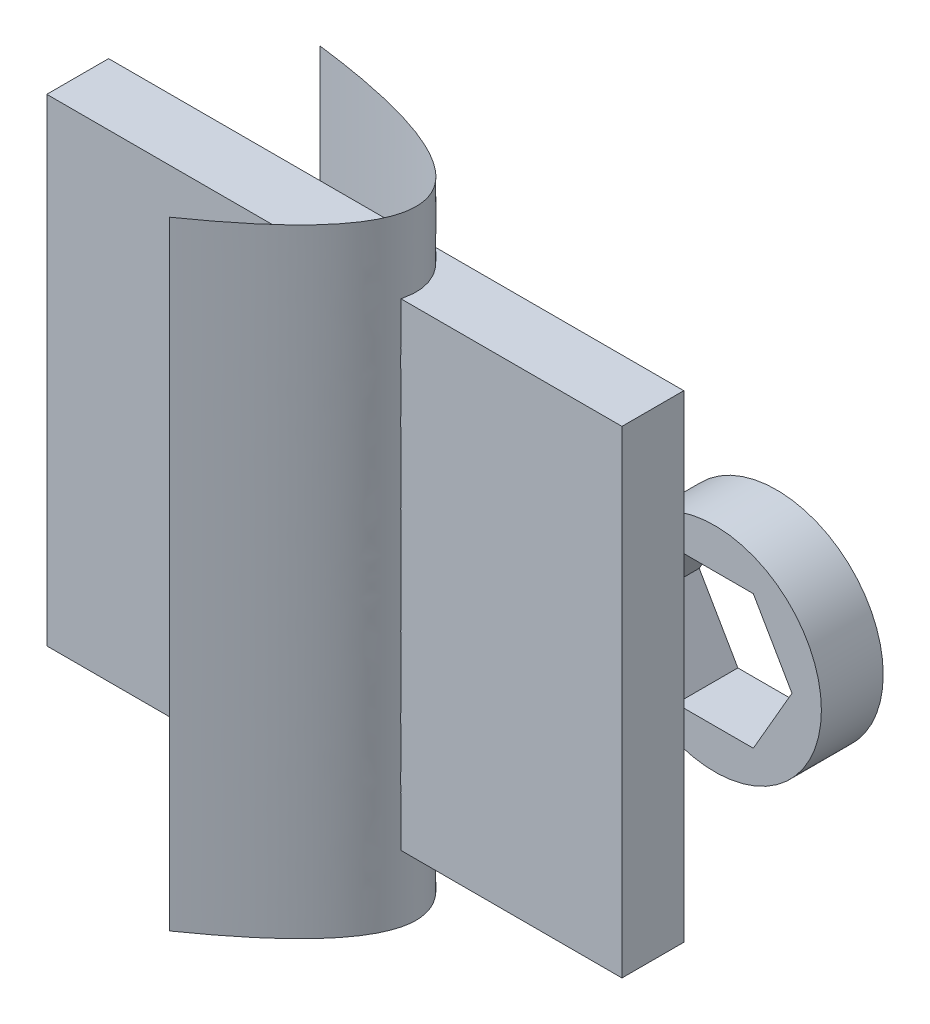
ISO-10303-21;
HEADER;
FILE_DESCRIPTION(('STEP AP214'),'2;1');
FILE_NAME('part.step','',(''),(''),'','','');
FILE_SCHEMA(('AUTOMOTIVE_DESIGN { 1 0 10303 214 1 1 1 1 }'));
ENDSEC;
DATA;
#1=APPLICATION_CONTEXT('core data for automotive mechanical design processes');
#2=APPLICATION_PROTOCOL_DEFINITION('international standard','automotive_design',2000,#1);
#3=PRODUCT_CONTEXT('',#1,'mechanical');
#4=PRODUCT('Part','Part','',(#3));
#5=PRODUCT_RELATED_PRODUCT_CATEGORY('part','',(#4));
#6=PRODUCT_DEFINITION_FORMATION('','',#4);
#7=PRODUCT_DEFINITION_CONTEXT('part definition',#1,'design');
#8=PRODUCT_DEFINITION('design','',#6,#7);
#9=PRODUCT_DEFINITION_SHAPE('','',#8);
#10=(LENGTH_UNIT() NAMED_UNIT(*) SI_UNIT(.MILLI.,.METRE.));
#11=(NAMED_UNIT(*) PLANE_ANGLE_UNIT() SI_UNIT($,.RADIAN.));
#12=(NAMED_UNIT(*) SI_UNIT($,.STERADIAN.) SOLID_ANGLE_UNIT());
#13=UNCERTAINTY_MEASURE_WITH_UNIT(LENGTH_MEASURE(1.E-05),#10,'distance_accuracy_value','');
#14=(GEOMETRIC_REPRESENTATION_CONTEXT(3) GLOBAL_UNCERTAINTY_ASSIGNED_CONTEXT((#13)) GLOBAL_UNIT_ASSIGNED_CONTEXT((#10,
#11,#12)) REPRESENTATION_CONTEXT('',''));
#15=CARTESIAN_POINT('',(0.,0.,0.));
#16=DIRECTION('',(0.,0.,1.));
#17=DIRECTION('',(1.,0.,0.));
#18=AXIS2_PLACEMENT_3D('',#15,#16,#17);
#19=CARTESIAN_POINT('',(31.5477974420096,-0.618220233656477,-15.01));
#20=DIRECTION('',(-0.866025403784438,-0.5,0.));
#21=DIRECTION('',(0.5,-0.866025403784439,0.));
#22=AXIS2_PLACEMENT_3D('',#19,#20,#21);
#23=PLANE('',#22);
#24=DIRECTION('',(0.,0.,1.));
#25=VECTOR('',#24,1.);
#26=CARTESIAN_POINT('',(31.5477974420096,-0.618220233656477,-15.01));
#27=LINE('',#26,#25);
#28=CARTESIAN_POINT('',(31.5477974420096,-0.618220233656478,-15.));
#29=VERTEX_POINT('',#28);
#30=CARTESIAN_POINT('',(31.5477974420096,-0.618220233656478,-5.));
#31=VERTEX_POINT('',#30);
#32=EDGE_CURVE('E12',#29,#31,#27,.T.);
#33=ORIENTED_EDGE('',*,*,#32,.T.);
#34=DIRECTION('',(0.5,-0.866025403784439,0.));
#35=VECTOR('',#34,1.);
#36=CARTESIAN_POINT('',(34.6728959935132,-6.03104970352057,-5.));
#37=LINE('',#36,#35);
#38=CARTESIAN_POINT('',(37.7979945450167,-11.4438791733847,-5.));
#39=VERTEX_POINT('',#38);
#40=EDGE_CURVE('E66',#31,#39,#37,.T.);
#41=ORIENTED_EDGE('',*,*,#40,.T.);
#42=DIRECTION('',(0.,0.,1.));
#43=VECTOR('',#42,1.);
#44=CARTESIAN_POINT('',(37.7979945450167,-11.4438791733847,-15.01));
#45=LINE('',#44,#43);
#46=CARTESIAN_POINT('',(37.7979945450167,-11.4438791733847,-15.));
#47=VERTEX_POINT('',#46);
#48=EDGE_CURVE('E58',#47,#39,#45,.T.);
#49=ORIENTED_EDGE('',*,*,#48,.F.);
#50=DIRECTION('',(0.5,-0.866025403784439,0.));
#51=VECTOR('',#50,1.);
#52=CARTESIAN_POINT('',(34.6728959935132,-6.03104970352057,-15.));
#53=LINE('',#52,#51);
#54=EDGE_CURVE('E118',#29,#47,#53,.T.);
#55=ORIENTED_EDGE('',*,*,#54,.F.);
#56=EDGE_LOOP('',(#33,#41,#49,#55));
#57=FACE_BOUND('',#56,.T.);
#58=ADVANCED_FACE('F49',(#57),#23,.F.);
#59=CARTESIAN_POINT('',(37.7979945450167,10.2074387060717,-15.01));
#60=DIRECTION('',(-0.866025403784438,0.5,0.));
#61=DIRECTION('',(-0.5,-0.866025403784438,0.));
#62=AXIS2_PLACEMENT_3D('',#59,#60,#61);
#63=PLANE('',#62);
#64=DIRECTION('',(0.,0.,1.));
#65=VECTOR('',#64,1.);
#66=CARTESIAN_POINT('',(37.7979945450167,10.2074387060717,-15.01));
#67=LINE('',#66,#65);
#68=CARTESIAN_POINT('',(37.7979945450167,10.2074387060717,-15.));
#69=VERTEX_POINT('',#68);
#70=CARTESIAN_POINT('',(37.7979945450167,10.2074387060717,-5.));
#71=VERTEX_POINT('',#70);
#72=EDGE_CURVE('E145',#69,#71,#67,.T.);
#73=ORIENTED_EDGE('',*,*,#72,.T.);
#74=DIRECTION('',(-0.5,-0.866025403784438,0.));
#75=VECTOR('',#74,1.);
#76=CARTESIAN_POINT('',(34.6728959935132,4.79460923620761,-5.));
#77=LINE('',#76,#75);
#78=EDGE_CURVE('E125',#71,#31,#77,.T.);
#79=ORIENTED_EDGE('',*,*,#78,.T.);
#80=ORIENTED_EDGE('',*,*,#32,.F.);
#81=DIRECTION('',(-0.5,-0.866025403784438,0.));
#82=VECTOR('',#81,1.);
#83=CARTESIAN_POINT('',(34.6728959935132,4.79460923620761,-15.));
#84=LINE('',#83,#82);
#85=EDGE_CURVE('E130',#69,#29,#84,.T.);
#86=ORIENTED_EDGE('',*,*,#85,.F.);
#87=EDGE_LOOP('',(#73,#79,#80,#86));
#88=FACE_BOUND('',#87,.T.);
#89=ADVANCED_FACE('F175',(#88),#63,.F.);
#90=CARTESIAN_POINT('',(50.298388751031,10.2074387060717,-15.01));
#91=DIRECTION('',(0.,1.,0.));
#92=DIRECTION('',(-1.,0.,0.));
#93=AXIS2_PLACEMENT_3D('',#90,#91,#92);
#94=PLANE('',#93);
#95=DIRECTION('',(0.,0.,1.));
#96=VECTOR('',#95,1.);
#97=CARTESIAN_POINT('',(50.298388751031,10.2074387060717,-15.01));
#98=LINE('',#97,#96);
#99=CARTESIAN_POINT('',(50.298388751031,10.2074387060717,-15.));
#100=VERTEX_POINT('',#99);
#101=CARTESIAN_POINT('',(50.298388751031,10.2074387060717,-5.));
#102=VERTEX_POINT('',#101);
#103=EDGE_CURVE('E123',#100,#102,#98,.T.);
#104=ORIENTED_EDGE('',*,*,#103,.T.);
#105=DIRECTION('',(-1.,0.,0.));
#106=VECTOR('',#105,1.);
#107=CARTESIAN_POINT('',(44.0481916480239,10.2074387060717,-5.));
#108=LINE('',#107,#106);
#109=EDGE_CURVE('E154',#102,#71,#108,.T.);
#110=ORIENTED_EDGE('',*,*,#109,.T.);
#111=ORIENTED_EDGE('',*,*,#72,.F.);
#112=DIRECTION('',(-1.,0.,0.));
#113=VECTOR('',#112,1.);
#114=CARTESIAN_POINT('',(44.0481916480239,10.2074387060717,-15.));
#115=LINE('',#114,#113);
#116=EDGE_CURVE('E133',#100,#69,#115,.T.);
#117=ORIENTED_EDGE('',*,*,#116,.F.);
#118=EDGE_LOOP('',(#104,#110,#111,#117));
#119=FACE_BOUND('',#118,.T.);
#120=ADVANCED_FACE('F181',(#119),#94,.F.);
#121=CARTESIAN_POINT('',(56.5485858540382,-0.61822023365648,-15.01));
#122=DIRECTION('',(0.866025403784438,0.5,0.));
#123=DIRECTION('',(-0.5,0.866025403784439,0.));
#124=AXIS2_PLACEMENT_3D('',#121,#122,#123);
#125=PLANE('',#124);
#126=DIRECTION('',(0.,0.,1.));
#127=VECTOR('',#126,1.);
#128=CARTESIAN_POINT('',(56.5485858540382,-0.61822023365648,-15.01));
#129=LINE('',#128,#127);
#130=CARTESIAN_POINT('',(56.5485858540382,-0.61822023365648,-15.));
#131=VERTEX_POINT('',#130);
#132=CARTESIAN_POINT('',(56.5485858540382,-0.61822023365648,-5.));
#133=VERTEX_POINT('',#132);
#134=EDGE_CURVE('E110',#131,#133,#129,.T.);
#135=ORIENTED_EDGE('',*,*,#134,.T.);
#136=DIRECTION('',(-0.5,0.866025403784439,0.));
#137=VECTOR('',#136,1.);
#138=CARTESIAN_POINT('',(53.4234873025346,4.79460923620762,-5.));
#139=LINE('',#138,#137);
#140=EDGE_CURVE('E142',#133,#102,#139,.T.);
#141=ORIENTED_EDGE('',*,*,#140,.T.);
#142=ORIENTED_EDGE('',*,*,#103,.F.);
#143=DIRECTION('',(-0.5,0.866025403784439,0.));
#144=VECTOR('',#143,1.);
#145=CARTESIAN_POINT('',(53.4234873025346,4.79460923620762,-15.));
#146=LINE('',#145,#144);
#147=EDGE_CURVE('E113',#131,#100,#146,.T.);
#148=ORIENTED_EDGE('',*,*,#147,.F.);
#149=EDGE_LOOP('',(#135,#141,#142,#148));
#150=FACE_BOUND('',#149,.T.);
#151=ADVANCED_FACE('F141',(#150),#125,.F.);
#152=CARTESIAN_POINT('',(50.298388751031,-11.4438791733847,-15.01));
#153=DIRECTION('',(0.866025403784439,-0.5,0.));
#154=DIRECTION('',(0.5,0.866025403784439,0.));
#155=AXIS2_PLACEMENT_3D('',#152,#153,#154);
#156=PLANE('',#155);
#157=DIRECTION('',(0.,0.,1.));
#158=VECTOR('',#157,1.);
#159=CARTESIAN_POINT('',(50.298388751031,-11.4438791733847,-15.01));
#160=LINE('',#159,#158);
#161=CARTESIAN_POINT('',(50.298388751031,-11.4438791733847,-15.));
#162=VERTEX_POINT('',#161);
#163=CARTESIAN_POINT('',(50.298388751031,-11.4438791733847,-5.));
#164=VERTEX_POINT('',#163);
#165=EDGE_CURVE('E107',#162,#164,#160,.T.);
#166=ORIENTED_EDGE('',*,*,#165,.T.);
#167=DIRECTION('',(0.5,0.866025403784439,0.));
#168=VECTOR('',#167,1.);
#169=CARTESIAN_POINT('',(53.4234873025346,-6.03104970352058,-5.));
#170=LINE('',#169,#168);
#171=EDGE_CURVE('E151',#164,#133,#170,.T.);
#172=ORIENTED_EDGE('',*,*,#171,.T.);
#173=ORIENTED_EDGE('',*,*,#134,.F.);
#174=DIRECTION('',(0.5,0.866025403784439,0.));
#175=VECTOR('',#174,1.);
#176=CARTESIAN_POINT('',(53.4234873025346,-6.03104970352058,-15.));
#177=LINE('',#176,#175);
#178=EDGE_CURVE('E102',#162,#131,#177,.T.);
#179=ORIENTED_EDGE('',*,*,#178,.F.);
#180=EDGE_LOOP('',(#166,#172,#173,#179));
#181=FACE_BOUND('',#180,.T.);
#182=ADVANCED_FACE('F104',(#181),#156,.F.);
#183=CARTESIAN_POINT('',(37.7979945450167,-11.4438791733847,-15.01));
#184=DIRECTION('',(0.,-1.,0.));
#185=DIRECTION('',(1.,0.,0.));
#186=AXIS2_PLACEMENT_3D('',#183,#184,#185);
#187=PLANE('',#186);
#188=ORIENTED_EDGE('',*,*,#48,.T.);
#189=DIRECTION('',(1.,0.,0.));
#190=VECTOR('',#189,1.);
#191=CARTESIAN_POINT('',(44.0481916480239,-11.4438791733847,-5.));
#192=LINE('',#191,#190);
#193=EDGE_CURVE('E121',#39,#164,#192,.T.);
#194=ORIENTED_EDGE('',*,*,#193,.T.);
#195=ORIENTED_EDGE('',*,*,#165,.F.);
#196=DIRECTION('',(1.,0.,0.));
#197=VECTOR('',#196,1.);
#198=CARTESIAN_POINT('',(44.0481916480239,-11.4438791733847,-15.));
#199=LINE('',#198,#197);
#200=EDGE_CURVE('E53',#47,#162,#199,.T.);
#201=ORIENTED_EDGE('',*,*,#200,.F.);
#202=EDGE_LOOP('',(#188,#194,#195,#201));
#203=FACE_BOUND('',#202,.T.);
#204=ADVANCED_FACE('F51',(#203),#187,.F.);
#205=CARTESIAN_POINT('',(44.0481916480239,-0.618220233656479,-15.));
#206=DIRECTION('',(0.,0.,1.));
#207=DIRECTION('',(1.,0.,0.));
#208=AXIS2_PLACEMENT_3D('',#205,#206,#207);
#209=CYLINDRICAL_SURFACE('',#208,17.2617733123611);
#210=CARTESIAN_POINT('',(44.0481916480239,-0.618220233656479,-15.));
#211=DIRECTION('',(0.,0.,1.));
#212=DIRECTION('',(1.,0.,0.));
#213=AXIS2_PLACEMENT_3D('',#210,#211,#212);
#214=CIRCLE('',#213,17.2617733123611);
#215=CARTESIAN_POINT('',(61.309964960385,-0.618220233656479,-15.));
#216=VERTEX_POINT('',#215);
#217=EDGE_CURVE('E131',#216,#216,#214,.T.);
#218=ORIENTED_EDGE('',*,*,#217,.T.);
#219=EDGE_LOOP('',(#218));
#220=FACE_BOUND('',#219,.T.);
#221=CARTESIAN_POINT('',(44.0481916480239,-0.618220233656479,-5.));
#222=DIRECTION('',(0.,0.,1.));
#223=DIRECTION('',(1.,0.,0.));
#224=AXIS2_PLACEMENT_3D('',#221,#222,#223);
#225=CIRCLE('',#224,17.2617733123611);
#226=CARTESIAN_POINT('',(61.309964960385,-0.618220233656479,-5.));
#227=VERTEX_POINT('',#226);
#228=EDGE_CURVE('E158',#227,#227,#225,.T.);
#229=ORIENTED_EDGE('',*,*,#228,.F.);
#230=EDGE_LOOP('',(#229));
#231=FACE_BOUND('',#230,.T.);
#232=ADVANCED_FACE('F164',(#220,#231),#209,.T.);
#233=CARTESIAN_POINT('',(44.0481916480239,-0.618220233656479,-5.));
#234=DIRECTION('',(0.,0.,1.));
#235=DIRECTION('',(1.,0.,0.));
#236=AXIS2_PLACEMENT_3D('',#233,#234,#235);
#237=PLANE('',#236);
#238=ORIENTED_EDGE('',*,*,#193,.F.);
#239=ORIENTED_EDGE('',*,*,#40,.F.);
#240=ORIENTED_EDGE('',*,*,#78,.F.);
#241=ORIENTED_EDGE('',*,*,#109,.F.);
#242=ORIENTED_EDGE('',*,*,#140,.F.);
#243=ORIENTED_EDGE('',*,*,#171,.F.);
#244=EDGE_LOOP('',(#238,#239,#240,#241,#242,#243));
#245=FACE_BOUND('',#244,.T.);
#246=ORIENTED_EDGE('',*,*,#228,.T.);
#247=EDGE_LOOP('',(#246));
#248=FACE_BOUND('',#247,.T.);
#249=ADVANCED_FACE('F167',(#245,#248),#237,.T.);
#250=CARTESIAN_POINT('',(44.0481916480239,-0.618220233656479,-15.));
#251=DIRECTION('',(0.,0.,1.));
#252=DIRECTION('',(1.,0.,0.));
#253=AXIS2_PLACEMENT_3D('',#250,#251,#252);
#254=PLANE('',#253);
#255=ORIENTED_EDGE('',*,*,#54,.T.);
#256=ORIENTED_EDGE('',*,*,#200,.T.);
#257=ORIENTED_EDGE('',*,*,#178,.T.);
#258=ORIENTED_EDGE('',*,*,#147,.T.);
#259=ORIENTED_EDGE('',*,*,#116,.T.);
#260=ORIENTED_EDGE('',*,*,#85,.T.);
#261=EDGE_LOOP('',(#255,#256,#257,#258,#259,#260));
#262=FACE_BOUND('',#261,.T.);
#263=ORIENTED_EDGE('',*,*,#217,.F.);
#264=EDGE_LOOP('',(#263));
#265=FACE_BOUND('',#264,.T.);
#266=ADVANCED_FACE('F115',(#262,#265),#254,.F.);
#267=CLOSED_SHELL('',(#58,#89,#120,#151,#182,#204,#232,#249,#266));
#268=MANIFOLD_SOLID_BREP('B2',#267);
#269=CARTESIAN_POINT('',(-9.8895273624505,0.,29.2716498296639));
#270=CARTESIAN_POINT('',(32.2081101978187,0.,-0.156276991708373));
#271=CARTESIAN_POINT('',(-21.6770448247652,0.,-6.89005628353885));
#272=B_SPLINE_CURVE_WITH_KNOTS('',2,(#269,#270,#271),.UNSPECIFIED.,.F.,.F.,(3,3),(0.,1.),.UNSPECIFIED.);
#273=DIRECTION('',(0.,1.,0.));
#274=VECTOR('',#273,1.);
#275=SURFACE_OF_LINEAR_EXTRUSION('',#272,#274);
#276=CARTESIAN_POINT('',(-9.8895273624505,50.,29.2716498296639));
#277=CARTESIAN_POINT('',(32.2081101978187,50.,-0.156276991708373));
#278=CARTESIAN_POINT('',(-21.6770448247652,50.,-6.89005628353885));
#279=B_SPLINE_CURVE_WITH_KNOTS('',2,(#276,#277,#278),.UNSPECIFIED.,.F.,.F.,(3,3),(0.,1.),.UNSPECIFIED.);
#280=CARTESIAN_POINT('',(-9.8895273624505,50.,29.2716498296639));
#281=VERTEX_POINT('',#280);
#282=CARTESIAN_POINT('',(-21.6770448247652,50.,-6.89005628353885));
#283=VERTEX_POINT('',#282);
#284=EDGE_CURVE('E264',#281,#283,#279,.T.);
#285=ORIENTED_EDGE('',*,*,#284,.F.);
#286=DIRECTION('',(0.,1.,0.));
#287=VECTOR('',#286,1.);
#288=CARTESIAN_POINT('',(-9.8895273624505,0.,29.2716498296639));
#289=LINE('',#288,#287);
#290=CARTESIAN_POINT('',(-9.8895273624505,-50.,29.2716498296639));
#291=VERTEX_POINT('',#290);
#292=EDGE_CURVE('E256',#291,#281,#289,.T.);
#293=ORIENTED_EDGE('',*,*,#292,.F.);
#294=CARTESIAN_POINT('',(-9.8895273624505,-50.,29.2716498296639));
#295=CARTESIAN_POINT('',(32.2081101978187,-50.,-0.156276991708373));
#296=CARTESIAN_POINT('',(-21.6770448247652,-50.,-6.89005628353885));
#297=B_SPLINE_CURVE_WITH_KNOTS('',2,(#294,#295,#296),.UNSPECIFIED.,.F.,.F.,(3,3),(0.,1.),.UNSPECIFIED.);
#298=CARTESIAN_POINT('',(-21.6770448247652,-50.,-6.89005628353885));
#299=VERTEX_POINT('',#298);
#300=EDGE_CURVE('E274',#291,#299,#297,.T.);
#301=ORIENTED_EDGE('',*,*,#300,.T.);
#302=DIRECTION('',(0.,1.,0.));
#303=VECTOR('',#302,1.);
#304=CARTESIAN_POINT('',(-21.6770448247652,0.,-6.89005628353885));
#305=LINE('',#304,#303);
#306=EDGE_CURVE('E47',#299,#283,#305,.T.);
#307=ORIENTED_EDGE('',*,*,#306,.T.);
#308=EDGE_LOOP('',(#285,#293,#301,#307));
#309=FACE_BOUND('',#308,.T.);
#310=ADVANCED_FACE('F254',(#309),#275,.T.);
#311=OPEN_SHELL('',(#310));
#312=SHELL_BASED_SURFACE_MODEL('B6',(#311));
#313=CARTESIAN_POINT('',(-48.9939535172757,38.0205443698732,10.));
#314=DIRECTION('',(1.,0.,0.));
#315=DIRECTION('',(0.,0.,-1.));
#316=AXIS2_PLACEMENT_3D('',#313,#314,#315);
#317=PLANE('',#316);
#318=DIRECTION('',(0.,-1.,0.));
#319=VECTOR('',#318,1.);
#320=CARTESIAN_POINT('',(-48.9939535172757,38.0205443698732,0.));
#321=LINE('',#320,#319);
#322=CARTESIAN_POINT('',(-48.9939535172757,38.0205443698732,0.));
#323=VERTEX_POINT('',#322);
#324=CARTESIAN_POINT('',(-48.9939535172757,-39.2569848371862,0.));
#325=VERTEX_POINT('',#324);
#326=EDGE_CURVE('E377',#323,#325,#321,.T.);
#327=ORIENTED_EDGE('',*,*,#326,.T.);
#328=DIRECTION('',(0.,0.,-1.));
#329=VECTOR('',#328,1.);
#330=CARTESIAN_POINT('',(-48.9939535172757,-39.2569848371862,10.));
#331=LINE('',#330,#329);
#332=CARTESIAN_POINT('',(-48.9939535172757,-39.2569848371862,10.));
#333=VERTEX_POINT('',#332);
#334=EDGE_CURVE('E252',#333,#325,#331,.T.);
#335=ORIENTED_EDGE('',*,*,#334,.F.);
#336=DIRECTION('',(0.,-1.,0.));
#337=VECTOR('',#336,1.);
#338=CARTESIAN_POINT('',(-48.9939535172757,38.0205443698732,10.));
#339=LINE('',#338,#337);
#340=CARTESIAN_POINT('',(-48.9939535172757,38.0205443698732,10.));
#341=VERTEX_POINT('',#340);
#342=EDGE_CURVE('E365',#341,#333,#339,.T.);
#343=ORIENTED_EDGE('',*,*,#342,.F.);
#344=DIRECTION('',(0.,0.,-1.));
#345=VECTOR('',#344,1.);
#346=CARTESIAN_POINT('',(-48.9939535172757,38.0205443698732,10.));
#347=LINE('',#346,#345);
#348=EDGE_CURVE('E373',#341,#323,#347,.T.);
#349=ORIENTED_EDGE('',*,*,#348,.T.);
#350=EDGE_LOOP('',(#327,#335,#343,#349));
#351=FACE_BOUND('',#350,.T.);
#352=ADVANCED_FACE('F314',(#351),#317,.F.);
#353=CARTESIAN_POINT('',(-48.9939535172757,-39.2569848371862,10.));
#354=DIRECTION('',(0.,1.,0.));
#355=DIRECTION('',(0.,0.,1.));
#356=AXIS2_PLACEMENT_3D('',#353,#354,#355);
#357=PLANE('',#356);
#358=DIRECTION('',(1.,0.,0.));
#359=VECTOR('',#358,1.);
#360=CARTESIAN_POINT('',(-48.9939535172757,-39.2569848371862,0.));
#361=LINE('',#360,#359);
#362=CARTESIAN_POINT('',(44.0481916480239,-39.2569848371862,0.));
#363=VERTEX_POINT('',#362);
#364=EDGE_CURVE('E369',#325,#363,#361,.T.);
#365=ORIENTED_EDGE('',*,*,#364,.T.);
#366=DIRECTION('',(0.,0.,-1.));
#367=VECTOR('',#366,1.);
#368=CARTESIAN_POINT('',(44.0481916480239,-39.2569848371862,10.));
#369=LINE('',#368,#367);
#370=CARTESIAN_POINT('',(44.0481916480239,-39.2569848371862,10.));
#371=VERTEX_POINT('',#370);
#372=EDGE_CURVE('E322',#371,#363,#369,.T.);
#373=ORIENTED_EDGE('',*,*,#372,.F.);
#374=DIRECTION('',(1.,0.,0.));
#375=VECTOR('',#374,1.);
#376=CARTESIAN_POINT('',(-48.9939535172757,-39.2569848371862,10.));
#377=LINE('',#376,#375);
#378=EDGE_CURVE('E360',#333,#371,#377,.T.);
#379=ORIENTED_EDGE('',*,*,#378,.F.);
#380=ORIENTED_EDGE('',*,*,#334,.T.);
#381=EDGE_LOOP('',(#365,#373,#379,#380));
#382=FACE_BOUND('',#381,.T.);
#383=ADVANCED_FACE('F368',(#382),#357,.F.);
#384=CARTESIAN_POINT('',(44.0481916480239,38.0205443698732,10.));
#385=DIRECTION('',(-1.,0.,0.));
#386=DIRECTION('',(0.,0.,1.));
#387=AXIS2_PLACEMENT_3D('',#384,#385,#386);
#388=PLANE('',#387);
#389=DIRECTION('',(0.,1.,0.));
#390=VECTOR('',#389,1.);
#391=CARTESIAN_POINT('',(44.0481916480239,38.0205443698732,0.));
#392=LINE('',#391,#390);
#393=CARTESIAN_POINT('',(44.0481916480239,38.0205443698732,0.));
#394=VERTEX_POINT('',#393);
#395=EDGE_CURVE('E347',#363,#394,#392,.T.);
#396=ORIENTED_EDGE('',*,*,#395,.T.);
#397=DIRECTION('',(0.,0.,-1.));
#398=VECTOR('',#397,1.);
#399=CARTESIAN_POINT('',(44.0481916480239,38.0205443698732,10.));
#400=LINE('',#399,#398);
#401=CARTESIAN_POINT('',(44.0481916480239,38.0205443698732,10.));
#402=VERTEX_POINT('',#401);
#403=EDGE_CURVE('E370',#402,#394,#400,.T.);
#404=ORIENTED_EDGE('',*,*,#403,.F.);
#405=DIRECTION('',(0.,1.,0.));
#406=VECTOR('',#405,1.);
#407=CARTESIAN_POINT('',(44.0481916480239,38.0205443698732,10.));
#408=LINE('',#407,#406);
#409=EDGE_CURVE('E363',#371,#402,#408,.T.);
#410=ORIENTED_EDGE('',*,*,#409,.F.);
#411=ORIENTED_EDGE('',*,*,#372,.T.);
#412=EDGE_LOOP('',(#396,#404,#410,#411));
#413=FACE_BOUND('',#412,.T.);
#414=ADVANCED_FACE('F371',(#413),#388,.F.);
#415=CARTESIAN_POINT('',(-48.9939535172757,38.0205443698732,10.));
#416=DIRECTION('',(0.,-1.,0.));
#417=DIRECTION('',(0.,0.,-1.));
#418=AXIS2_PLACEMENT_3D('',#415,#416,#417);
#419=PLANE('',#418);
#420=DIRECTION('',(-1.,0.,0.));
#421=VECTOR('',#420,1.);
#422=CARTESIAN_POINT('',(-48.9939535172757,38.0205443698732,0.));
#423=LINE('',#422,#421);
#424=EDGE_CURVE('E353',#394,#323,#423,.T.);
#425=ORIENTED_EDGE('',*,*,#424,.T.);
#426=ORIENTED_EDGE('',*,*,#348,.F.);
#427=DIRECTION('',(-1.,0.,0.));
#428=VECTOR('',#427,1.);
#429=CARTESIAN_POINT('',(-48.9939535172757,38.0205443698732,10.));
#430=LINE('',#429,#428);
#431=EDGE_CURVE('E330',#402,#341,#430,.T.);
#432=ORIENTED_EDGE('',*,*,#431,.F.);
#433=ORIENTED_EDGE('',*,*,#403,.T.);
#434=EDGE_LOOP('',(#425,#426,#432,#433));
#435=FACE_BOUND('',#434,.T.);
#436=ADVANCED_FACE('F384',(#435),#419,.F.);
#437=CARTESIAN_POINT('',(0.,0.,10.));
#438=DIRECTION('',(0.,0.,1.));
#439=DIRECTION('',(1.,0.,0.));
#440=AXIS2_PLACEMENT_3D('',#437,#438,#439);
#441=PLANE('',#440);
#442=ORIENTED_EDGE('',*,*,#342,.T.);
#443=ORIENTED_EDGE('',*,*,#378,.T.);
#444=ORIENTED_EDGE('',*,*,#409,.T.);
#445=ORIENTED_EDGE('',*,*,#431,.T.);
#446=EDGE_LOOP('',(#442,#443,#444,#445));
#447=FACE_BOUND('',#446,.T.);
#448=ADVANCED_FACE('F361',(#447),#441,.T.);
#449=CARTESIAN_POINT('',(0.,0.,0.));
#450=DIRECTION('',(0.,0.,1.));
#451=DIRECTION('',(1.,0.,0.));
#452=AXIS2_PLACEMENT_3D('',#449,#450,#451);
#453=PLANE('',#452);
#454=ORIENTED_EDGE('',*,*,#326,.F.);
#455=ORIENTED_EDGE('',*,*,#424,.F.);
#456=ORIENTED_EDGE('',*,*,#395,.F.);
#457=ORIENTED_EDGE('',*,*,#364,.F.);
#458=EDGE_LOOP('',(#454,#455,#456,#457));
#459=FACE_BOUND('',#458,.T.);
#460=ADVANCED_FACE('F387',(#459),#453,.F.);
#461=CLOSED_SHELL('',(#352,#383,#414,#436,#448,#460));
#462=MANIFOLD_SOLID_BREP('B41',#461);
#463=ADVANCED_BREP_SHAPE_REPRESENTATION('',(#18,#268,#462),#14);
#464=MANIFOLD_SURFACE_SHAPE_REPRESENTATION('',(#18,#312),#14);
#465=SHAPE_REPRESENTATION('',(#18),#14);
#466=SHAPE_DEFINITION_REPRESENTATION(#9,#465);
#467=SHAPE_REPRESENTATION_RELATIONSHIP('','',#465,#463);
#468=SHAPE_REPRESENTATION_RELATIONSHIP('','',#465,#464);
ENDSEC;
END-ISO-10303-21;
